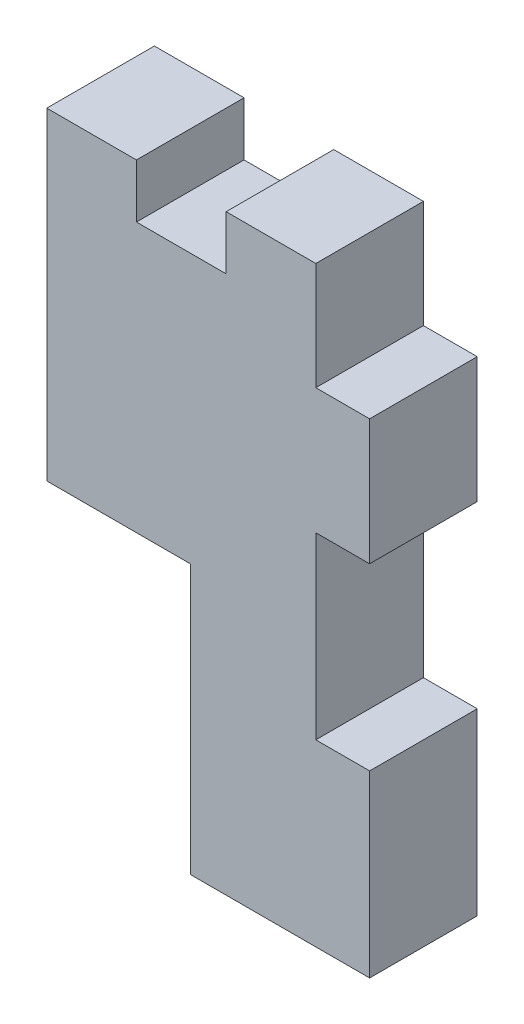
ISO-10303-21;
HEADER;
FILE_DESCRIPTION(('STEP AP214'),'2;1');
FILE_NAME('part.step','',(''),(''),'','','');
FILE_SCHEMA(('AUTOMOTIVE_DESIGN { 1 0 10303 214 1 1 1 1 }'));
ENDSEC;
DATA;
#1=APPLICATION_CONTEXT('core data for automotive mechanical design processes');
#2=APPLICATION_PROTOCOL_DEFINITION('international standard','automotive_design',2000,#1);
#3=PRODUCT_CONTEXT('',#1,'mechanical');
#4=PRODUCT('Part','Part','',(#3));
#5=PRODUCT_RELATED_PRODUCT_CATEGORY('part','',(#4));
#6=PRODUCT_DEFINITION_FORMATION('','',#4);
#7=PRODUCT_DEFINITION_CONTEXT('part definition',#1,'design');
#8=PRODUCT_DEFINITION('design','',#6,#7);
#9=PRODUCT_DEFINITION_SHAPE('','',#8);
#10=(LENGTH_UNIT() NAMED_UNIT(*) SI_UNIT(.MILLI.,.METRE.));
#11=(NAMED_UNIT(*) PLANE_ANGLE_UNIT() SI_UNIT($,.RADIAN.));
#12=(NAMED_UNIT(*) SI_UNIT($,.STERADIAN.) SOLID_ANGLE_UNIT());
#13=UNCERTAINTY_MEASURE_WITH_UNIT(LENGTH_MEASURE(1.E-05),#10,'distance_accuracy_value','');
#14=(GEOMETRIC_REPRESENTATION_CONTEXT(3) GLOBAL_UNCERTAINTY_ASSIGNED_CONTEXT((#13)) GLOBAL_UNIT_ASSIGNED_CONTEXT((#10,
#11,#12)) REPRESENTATION_CONTEXT('',''));
#15=CARTESIAN_POINT('',(0.,0.,0.));
#16=DIRECTION('',(0.,0.,1.));
#17=DIRECTION('',(1.,0.,0.));
#18=AXIS2_PLACEMENT_3D('',#15,#16,#17);
#19=CARTESIAN_POINT('',(-15.,0.,3.));
#20=DIRECTION('',(-1.,0.,0.));
#21=DIRECTION('',(0.,0.,1.));
#22=AXIS2_PLACEMENT_3D('',#19,#20,#21);
#23=PLANE('',#22);
#24=DIRECTION('',(0.,1.,0.));
#25=VECTOR('',#24,1.);
#26=CARTESIAN_POINT('',(-15.,0.,-3.));
#27=LINE('',#26,#25);
#28=CARTESIAN_POINT('',(-15.,15.,-3.));
#29=VERTEX_POINT('',#28);
#30=CARTESIAN_POINT('',(-15.,33.,-3.));
#31=VERTEX_POINT('',#30);
#32=EDGE_CURVE('E178',#29,#31,#27,.T.);
#33=ORIENTED_EDGE('',*,*,#32,.F.);
#34=DIRECTION('',(0.,0.,-1.));
#35=VECTOR('',#34,1.);
#36=CARTESIAN_POINT('',(-15.,15.,3.));
#37=LINE('',#36,#35);
#38=CARTESIAN_POINT('',(-15.,15.,3.));
#39=VERTEX_POINT('',#38);
#40=EDGE_CURVE('E11',#39,#29,#37,.T.);
#41=ORIENTED_EDGE('',*,*,#40,.F.);
#42=DIRECTION('',(0.,1.,0.));
#43=VECTOR('',#42,1.);
#44=CARTESIAN_POINT('',(-15.,0.,3.));
#45=LINE('',#44,#43);
#46=CARTESIAN_POINT('',(-15.,33.,3.));
#47=VERTEX_POINT('',#46);
#48=EDGE_CURVE('E213',#39,#47,#45,.T.);
#49=ORIENTED_EDGE('',*,*,#48,.T.);
#50=DIRECTION('',(0.,0.,-1.));
#51=VECTOR('',#50,1.);
#52=CARTESIAN_POINT('',(-15.,33.,3.));
#53=LINE('',#52,#51);
#54=EDGE_CURVE('E60',#47,#31,#53,.T.);
#55=ORIENTED_EDGE('',*,*,#54,.T.);
#56=EDGE_LOOP('',(#33,#41,#49,#55));
#57=FACE_BOUND('',#56,.T.);
#58=ADVANCED_FACE('F37',(#57),#23,.T.);
#59=CARTESIAN_POINT('',(0.,15.,3.));
#60=DIRECTION('',(0.,1.,0.));
#61=DIRECTION('',(0.,0.,1.));
#62=AXIS2_PLACEMENT_3D('',#59,#60,#61);
#63=PLANE('',#62);
#64=DIRECTION('',(1.,0.,0.));
#65=VECTOR('',#64,1.);
#66=CARTESIAN_POINT('',(0.,15.,-3.));
#67=LINE('',#66,#65);
#68=CARTESIAN_POINT('',(-7.,15.,-3.));
#69=VERTEX_POINT('',#68);
#70=EDGE_CURVE('E180',#29,#69,#67,.T.);
#71=ORIENTED_EDGE('',*,*,#70,.T.);
#72=DIRECTION('',(0.,0.,-1.));
#73=VECTOR('',#72,1.);
#74=CARTESIAN_POINT('',(-7.,15.,3.));
#75=LINE('',#74,#73);
#76=CARTESIAN_POINT('',(-7.,15.,3.));
#77=VERTEX_POINT('',#76);
#78=EDGE_CURVE('E44',#77,#69,#75,.T.);
#79=ORIENTED_EDGE('',*,*,#78,.F.);
#80=DIRECTION('',(1.,0.,0.));
#81=VECTOR('',#80,1.);
#82=CARTESIAN_POINT('',(0.,15.,3.));
#83=LINE('',#82,#81);
#84=EDGE_CURVE('E284',#39,#77,#83,.T.);
#85=ORIENTED_EDGE('',*,*,#84,.F.);
#86=ORIENTED_EDGE('',*,*,#40,.T.);
#87=EDGE_LOOP('',(#71,#79,#85,#86));
#88=FACE_BOUND('',#87,.T.);
#89=ADVANCED_FACE('F327',(#88),#63,.F.);
#90=CARTESIAN_POINT('',(-7.,0.,3.));
#91=DIRECTION('',(1.,0.,0.));
#92=DIRECTION('',(0.,1.,0.));
#93=AXIS2_PLACEMENT_3D('',#90,#91,#92);
#94=PLANE('',#93);
#95=DIRECTION('',(0.,-1.,0.));
#96=VECTOR('',#95,1.);
#97=CARTESIAN_POINT('',(-7.,0.,-3.));
#98=LINE('',#97,#96);
#99=CARTESIAN_POINT('',(-7.,0.,-3.));
#100=VERTEX_POINT('',#99);
#101=EDGE_CURVE('E183',#69,#100,#98,.T.);
#102=ORIENTED_EDGE('',*,*,#101,.T.);
#103=DIRECTION('',(0.,0.,-1.));
#104=VECTOR('',#103,1.);
#105=CARTESIAN_POINT('',(-7.,0.,3.));
#106=LINE('',#105,#104);
#107=CARTESIAN_POINT('',(-7.,0.,3.));
#108=VERTEX_POINT('',#107);
#109=EDGE_CURVE('E235',#108,#100,#106,.T.);
#110=ORIENTED_EDGE('',*,*,#109,.F.);
#111=DIRECTION('',(0.,-1.,0.));
#112=VECTOR('',#111,1.);
#113=CARTESIAN_POINT('',(-7.,0.,3.));
#114=LINE('',#113,#112);
#115=EDGE_CURVE('E244',#77,#108,#114,.T.);
#116=ORIENTED_EDGE('',*,*,#115,.F.);
#117=ORIENTED_EDGE('',*,*,#78,.T.);
#118=EDGE_LOOP('',(#102,#110,#116,#117));
#119=FACE_BOUND('',#118,.T.);
#120=ADVANCED_FACE('F242',(#119),#94,.F.);
#121=CARTESIAN_POINT('',(0.,0.,3.));
#122=DIRECTION('',(0.,1.,0.));
#123=DIRECTION('',(0.,0.,1.));
#124=AXIS2_PLACEMENT_3D('',#121,#122,#123);
#125=PLANE('',#124);
#126=DIRECTION('',(1.,0.,0.));
#127=VECTOR('',#126,1.);
#128=CARTESIAN_POINT('',(0.,0.,-3.));
#129=LINE('',#128,#127);
#130=CARTESIAN_POINT('',(3.,0.,-3.));
#131=VERTEX_POINT('',#130);
#132=EDGE_CURVE('E185',#100,#131,#129,.T.);
#133=ORIENTED_EDGE('',*,*,#132,.T.);
#134=DIRECTION('',(0.,0.,-1.));
#135=VECTOR('',#134,1.);
#136=CARTESIAN_POINT('',(3.,0.,3.));
#137=LINE('',#136,#135);
#138=CARTESIAN_POINT('',(3.,0.,3.));
#139=VERTEX_POINT('',#138);
#140=EDGE_CURVE('E232',#139,#131,#137,.T.);
#141=ORIENTED_EDGE('',*,*,#140,.F.);
#142=DIRECTION('',(1.,0.,0.));
#143=VECTOR('',#142,1.);
#144=CARTESIAN_POINT('',(0.,0.,3.));
#145=LINE('',#144,#143);
#146=EDGE_CURVE('E262',#108,#139,#145,.T.);
#147=ORIENTED_EDGE('',*,*,#146,.F.);
#148=ORIENTED_EDGE('',*,*,#109,.T.);
#149=EDGE_LOOP('',(#133,#141,#147,#148));
#150=FACE_BOUND('',#149,.T.);
#151=ADVANCED_FACE('F252',(#150),#125,.F.);
#152=CARTESIAN_POINT('',(3.,0.,3.));
#153=DIRECTION('',(-1.,0.,0.));
#154=DIRECTION('',(0.,0.,1.));
#155=AXIS2_PLACEMENT_3D('',#152,#153,#154);
#156=PLANE('',#155);
#157=DIRECTION('',(0.,1.,0.));
#158=VECTOR('',#157,1.);
#159=CARTESIAN_POINT('',(3.,0.,-3.));
#160=LINE('',#159,#158);
#161=CARTESIAN_POINT('',(3.,10.,-3.));
#162=VERTEX_POINT('',#161);
#163=EDGE_CURVE('E187',#131,#162,#160,.T.);
#164=ORIENTED_EDGE('',*,*,#163,.T.);
#165=DIRECTION('',(0.,0.,-1.));
#166=VECTOR('',#165,1.);
#167=CARTESIAN_POINT('',(3.,10.,3.));
#168=LINE('',#167,#166);
#169=CARTESIAN_POINT('',(3.,10.,3.));
#170=VERTEX_POINT('',#169);
#171=EDGE_CURVE('E230',#170,#162,#168,.T.);
#172=ORIENTED_EDGE('',*,*,#171,.F.);
#173=DIRECTION('',(0.,1.,0.));
#174=VECTOR('',#173,1.);
#175=CARTESIAN_POINT('',(3.,0.,3.));
#176=LINE('',#175,#174);
#177=EDGE_CURVE('E258',#139,#170,#176,.T.);
#178=ORIENTED_EDGE('',*,*,#177,.F.);
#179=ORIENTED_EDGE('',*,*,#140,.T.);
#180=EDGE_LOOP('',(#164,#172,#178,#179));
#181=FACE_BOUND('',#180,.T.);
#182=ADVANCED_FACE('F256',(#181),#156,.F.);
#183=CARTESIAN_POINT('',(0.,10.,3.));
#184=DIRECTION('',(0.,1.,0.));
#185=DIRECTION('',(0.,0.,1.));
#186=AXIS2_PLACEMENT_3D('',#183,#184,#185);
#187=PLANE('',#186);
#188=DIRECTION('',(1.,0.,0.));
#189=VECTOR('',#188,1.);
#190=CARTESIAN_POINT('',(0.,10.,-3.));
#191=LINE('',#190,#189);
#192=CARTESIAN_POINT('',(0.,10.,-3.));
#193=VERTEX_POINT('',#192);
#194=EDGE_CURVE('E190',#193,#162,#191,.T.);
#195=ORIENTED_EDGE('',*,*,#194,.F.);
#196=DIRECTION('',(0.,0.,-1.));
#197=VECTOR('',#196,1.);
#198=CARTESIAN_POINT('',(0.,10.,3.));
#199=LINE('',#198,#197);
#200=CARTESIAN_POINT('',(0.,10.,3.));
#201=VERTEX_POINT('',#200);
#202=EDGE_CURVE('E228',#201,#193,#199,.T.);
#203=ORIENTED_EDGE('',*,*,#202,.F.);
#204=DIRECTION('',(1.,0.,0.));
#205=VECTOR('',#204,1.);
#206=CARTESIAN_POINT('',(0.,10.,3.));
#207=LINE('',#206,#205);
#208=EDGE_CURVE('E261',#201,#170,#207,.T.);
#209=ORIENTED_EDGE('',*,*,#208,.T.);
#210=ORIENTED_EDGE('',*,*,#171,.T.);
#211=EDGE_LOOP('',(#195,#203,#209,#210));
#212=FACE_BOUND('',#211,.T.);
#213=ADVANCED_FACE('F315',(#212),#187,.T.);
#214=CARTESIAN_POINT('',(0.,0.,3.));
#215=DIRECTION('',(-1.,0.,0.));
#216=DIRECTION('',(0.,0.,1.));
#217=AXIS2_PLACEMENT_3D('',#214,#215,#216);
#218=PLANE('',#217);
#219=DIRECTION('',(0.,1.,0.));
#220=VECTOR('',#219,1.);
#221=CARTESIAN_POINT('',(0.,0.,-3.));
#222=LINE('',#221,#220);
#223=CARTESIAN_POINT('',(0.,20.,-3.));
#224=VERTEX_POINT('',#223);
#225=EDGE_CURVE('E193',#193,#224,#222,.T.);
#226=ORIENTED_EDGE('',*,*,#225,.T.);
#227=DIRECTION('',(0.,0.,-1.));
#228=VECTOR('',#227,1.);
#229=CARTESIAN_POINT('',(0.,20.,3.));
#230=LINE('',#229,#228);
#231=CARTESIAN_POINT('',(0.,20.,3.));
#232=VERTEX_POINT('',#231);
#233=EDGE_CURVE('E225',#232,#224,#230,.T.);
#234=ORIENTED_EDGE('',*,*,#233,.F.);
#235=DIRECTION('',(0.,1.,0.));
#236=VECTOR('',#235,1.);
#237=CARTESIAN_POINT('',(0.,0.,3.));
#238=LINE('',#237,#236);
#239=EDGE_CURVE('E264',#201,#232,#238,.T.);
#240=ORIENTED_EDGE('',*,*,#239,.F.);
#241=ORIENTED_EDGE('',*,*,#202,.T.);
#242=EDGE_LOOP('',(#226,#234,#240,#241));
#243=FACE_BOUND('',#242,.T.);
#244=ADVANCED_FACE('F317',(#243),#218,.F.);
#245=CARTESIAN_POINT('',(0.,20.,3.));
#246=DIRECTION('',(0.,1.,0.));
#247=DIRECTION('',(0.,0.,1.));
#248=AXIS2_PLACEMENT_3D('',#245,#246,#247);
#249=PLANE('',#248);
#250=DIRECTION('',(1.,0.,0.));
#251=VECTOR('',#250,1.);
#252=CARTESIAN_POINT('',(0.,20.,-3.));
#253=LINE('',#252,#251);
#254=CARTESIAN_POINT('',(3.,20.,-3.));
#255=VERTEX_POINT('',#254);
#256=EDGE_CURVE('E195',#224,#255,#253,.T.);
#257=ORIENTED_EDGE('',*,*,#256,.T.);
#258=DIRECTION('',(0.,0.,-1.));
#259=VECTOR('',#258,1.);
#260=CARTESIAN_POINT('',(3.,20.,3.));
#261=LINE('',#260,#259);
#262=CARTESIAN_POINT('',(3.,20.,3.));
#263=VERTEX_POINT('',#262);
#264=EDGE_CURVE('E222',#263,#255,#261,.T.);
#265=ORIENTED_EDGE('',*,*,#264,.F.);
#266=DIRECTION('',(1.,0.,0.));
#267=VECTOR('',#266,1.);
#268=CARTESIAN_POINT('',(0.,20.,3.));
#269=LINE('',#268,#267);
#270=EDGE_CURVE('E270',#232,#263,#269,.T.);
#271=ORIENTED_EDGE('',*,*,#270,.F.);
#272=ORIENTED_EDGE('',*,*,#233,.T.);
#273=EDGE_LOOP('',(#257,#265,#271,#272));
#274=FACE_BOUND('',#273,.T.);
#275=ADVANCED_FACE('F309',(#274),#249,.F.);
#276=CARTESIAN_POINT('',(3.00000000000001,0.,3.));
#277=DIRECTION('',(1.,0.,0.));
#278=DIRECTION('',(0.,1.,0.));
#279=AXIS2_PLACEMENT_3D('',#276,#277,#278);
#280=PLANE('',#279);
#281=DIRECTION('',(0.,0.,1.));
#282=VECTOR('',#281,1.);
#283=CARTESIAN_POINT('',(3.,27.,-3.));
#284=LINE('',#283,#282);
#285=CARTESIAN_POINT('',(3.,27.,-3.));
#286=VERTEX_POINT('',#285);
#287=CARTESIAN_POINT('',(3.,27.,3.));
#288=VERTEX_POINT('',#287);
#289=EDGE_CURVE('E181',#286,#288,#284,.T.);
#290=ORIENTED_EDGE('',*,*,#289,.T.);
#291=DIRECTION('',(0.,-1.,0.));
#292=VECTOR('',#291,1.);
#293=CARTESIAN_POINT('',(3.00000000000001,0.,3.));
#294=LINE('',#293,#292);
#295=EDGE_CURVE('E273',#288,#263,#294,.T.);
#296=ORIENTED_EDGE('',*,*,#295,.T.);
#297=ORIENTED_EDGE('',*,*,#264,.T.);
#298=DIRECTION('',(0.,-1.,0.));
#299=VECTOR('',#298,1.);
#300=CARTESIAN_POINT('',(3.00000000000001,0.,-3.));
#301=LINE('',#300,#299);
#302=EDGE_CURVE('E198',#286,#255,#301,.T.);
#303=ORIENTED_EDGE('',*,*,#302,.F.);
#304=EDGE_LOOP('',(#290,#296,#297,#303));
#305=FACE_BOUND('',#304,.T.);
#306=ADVANCED_FACE('F304',(#305),#280,.T.);
#307=CARTESIAN_POINT('',(0.,0.,3.));
#308=DIRECTION('',(-1.,0.,0.));
#309=DIRECTION('',(0.,0.,1.));
#310=AXIS2_PLACEMENT_3D('',#307,#308,#309);
#311=PLANE('',#310);
#312=DIRECTION('',(0.,1.,0.));
#313=VECTOR('',#312,1.);
#314=CARTESIAN_POINT('',(0.,0.,-3.));
#315=LINE('',#314,#313);
#316=CARTESIAN_POINT('',(0.,27.,-3.));
#317=VERTEX_POINT('',#316);
#318=CARTESIAN_POINT('',(0.,33.,-3.));
#319=VERTEX_POINT('',#318);
#320=EDGE_CURVE('E51',#317,#319,#315,.T.);
#321=ORIENTED_EDGE('',*,*,#320,.T.);
#322=DIRECTION('',(0.,0.,-1.));
#323=VECTOR('',#322,1.);
#324=CARTESIAN_POINT('',(0.,33.,3.));
#325=LINE('',#324,#323);
#326=CARTESIAN_POINT('',(0.,33.,3.));
#327=VERTEX_POINT('',#326);
#328=EDGE_CURVE('E219',#327,#319,#325,.T.);
#329=ORIENTED_EDGE('',*,*,#328,.F.);
#330=DIRECTION('',(0.,1.,0.));
#331=VECTOR('',#330,1.);
#332=CARTESIAN_POINT('',(0.,0.,3.));
#333=LINE('',#332,#331);
#334=CARTESIAN_POINT('',(0.,27.,3.));
#335=VERTEX_POINT('',#334);
#336=EDGE_CURVE('E275',#335,#327,#333,.T.);
#337=ORIENTED_EDGE('',*,*,#336,.F.);
#338=DIRECTION('',(0.,0.,1.));
#339=VECTOR('',#338,1.);
#340=CARTESIAN_POINT('',(0.,27.,-3.));
#341=LINE('',#340,#339);
#342=EDGE_CURVE('E288',#317,#335,#341,.T.);
#343=ORIENTED_EDGE('',*,*,#342,.F.);
#344=EDGE_LOOP('',(#321,#329,#337,#343));
#345=FACE_BOUND('',#344,.T.);
#346=ADVANCED_FACE('F371',(#345),#311,.F.);
#347=CARTESIAN_POINT('',(0.,33.,3.));
#348=DIRECTION('',(0.,-1.,0.));
#349=DIRECTION('',(0.,0.,-1.));
#350=AXIS2_PLACEMENT_3D('',#347,#348,#349);
#351=PLANE('',#350);
#352=DIRECTION('',(-1.,0.,0.));
#353=VECTOR('',#352,1.);
#354=CARTESIAN_POINT('',(0.,33.,-3.));
#355=LINE('',#354,#353);
#356=CARTESIAN_POINT('',(-5.,33.,-3.));
#357=VERTEX_POINT('',#356);
#358=EDGE_CURVE('E201',#319,#357,#355,.T.);
#359=ORIENTED_EDGE('',*,*,#358,.T.);
#360=DIRECTION('',(0.,0.,-1.));
#361=VECTOR('',#360,1.);
#362=CARTESIAN_POINT('',(-5.,33.,3.));
#363=LINE('',#362,#361);
#364=CARTESIAN_POINT('',(-5.,33.,3.));
#365=VERTEX_POINT('',#364);
#366=EDGE_CURVE('E217',#365,#357,#363,.T.);
#367=ORIENTED_EDGE('',*,*,#366,.F.);
#368=DIRECTION('',(-1.,0.,0.));
#369=VECTOR('',#368,1.);
#370=CARTESIAN_POINT('',(0.,33.,3.));
#371=LINE('',#370,#369);
#372=EDGE_CURVE('E277',#327,#365,#371,.T.);
#373=ORIENTED_EDGE('',*,*,#372,.F.);
#374=ORIENTED_EDGE('',*,*,#328,.T.);
#375=EDGE_LOOP('',(#359,#367,#373,#374));
#376=FACE_BOUND('',#375,.T.);
#377=ADVANCED_FACE('F366',(#376),#351,.F.);
#378=CARTESIAN_POINT('',(-5.,0.,3.));
#379=DIRECTION('',(-1.,0.,0.));
#380=DIRECTION('',(0.,0.,1.));
#381=AXIS2_PLACEMENT_3D('',#378,#379,#380);
#382=PLANE('',#381);
#383=DIRECTION('',(0.,1.,0.));
#384=VECTOR('',#383,1.);
#385=CARTESIAN_POINT('',(-5.,0.,-3.));
#386=LINE('',#385,#384);
#387=CARTESIAN_POINT('',(-5.,30.,-3.));
#388=VERTEX_POINT('',#387);
#389=EDGE_CURVE('E204',#388,#357,#386,.T.);
#390=ORIENTED_EDGE('',*,*,#389,.F.);
#391=DIRECTION('',(0.,0.,-1.));
#392=VECTOR('',#391,1.);
#393=CARTESIAN_POINT('',(-5.,30.,3.));
#394=LINE('',#393,#392);
#395=CARTESIAN_POINT('',(-5.,30.,3.));
#396=VERTEX_POINT('',#395);
#397=EDGE_CURVE('E169',#396,#388,#394,.T.);
#398=ORIENTED_EDGE('',*,*,#397,.F.);
#399=DIRECTION('',(0.,1.,0.));
#400=VECTOR('',#399,1.);
#401=CARTESIAN_POINT('',(-5.,0.,3.));
#402=LINE('',#401,#400);
#403=EDGE_CURVE('E158',#396,#365,#402,.T.);
#404=ORIENTED_EDGE('',*,*,#403,.T.);
#405=ORIENTED_EDGE('',*,*,#366,.T.);
#406=EDGE_LOOP('',(#390,#398,#404,#405));
#407=FACE_BOUND('',#406,.T.);
#408=ADVANCED_FACE('F280',(#407),#382,.T.);
#409=CARTESIAN_POINT('',(0.,30.,3.));
#410=DIRECTION('',(0.,-1.,0.));
#411=DIRECTION('',(1.,0.,0.));
#412=AXIS2_PLACEMENT_3D('',#409,#410,#411);
#413=PLANE('',#412);
#414=DIRECTION('',(-1.,0.,0.));
#415=VECTOR('',#414,1.);
#416=CARTESIAN_POINT('',(0.,30.,-3.));
#417=LINE('',#416,#415);
#418=CARTESIAN_POINT('',(-10.,30.,-3.));
#419=VERTEX_POINT('',#418);
#420=EDGE_CURVE('E165',#388,#419,#417,.T.);
#421=ORIENTED_EDGE('',*,*,#420,.T.);
#422=DIRECTION('',(0.,0.,-1.));
#423=VECTOR('',#422,1.);
#424=CARTESIAN_POINT('',(-10.,30.,3.));
#425=LINE('',#424,#423);
#426=CARTESIAN_POINT('',(-10.,30.,3.));
#427=VERTEX_POINT('',#426);
#428=EDGE_CURVE('E162',#427,#419,#425,.T.);
#429=ORIENTED_EDGE('',*,*,#428,.F.);
#430=DIRECTION('',(-1.,0.,0.));
#431=VECTOR('',#430,1.);
#432=CARTESIAN_POINT('',(0.,30.,3.));
#433=LINE('',#432,#431);
#434=EDGE_CURVE('E149',#396,#427,#433,.T.);
#435=ORIENTED_EDGE('',*,*,#434,.F.);
#436=ORIENTED_EDGE('',*,*,#397,.T.);
#437=EDGE_LOOP('',(#421,#429,#435,#436));
#438=FACE_BOUND('',#437,.T.);
#439=ADVANCED_FACE('F163',(#438),#413,.F.);
#440=CARTESIAN_POINT('',(-10.,0.,3.));
#441=DIRECTION('',(-1.,0.,0.));
#442=DIRECTION('',(0.,0.,1.));
#443=AXIS2_PLACEMENT_3D('',#440,#441,#442);
#444=PLANE('',#443);
#445=DIRECTION('',(0.,1.,0.));
#446=VECTOR('',#445,1.);
#447=CARTESIAN_POINT('',(-10.,0.,-3.));
#448=LINE('',#447,#446);
#449=CARTESIAN_POINT('',(-10.,33.,-3.));
#450=VERTEX_POINT('',#449);
#451=EDGE_CURVE('E208',#419,#450,#448,.T.);
#452=ORIENTED_EDGE('',*,*,#451,.T.);
#453=DIRECTION('',(0.,0.,-1.));
#454=VECTOR('',#453,1.);
#455=CARTESIAN_POINT('',(-10.,33.,3.));
#456=LINE('',#455,#454);
#457=CARTESIAN_POINT('',(-10.,33.,3.));
#458=VERTEX_POINT('',#457);
#459=EDGE_CURVE('E170',#458,#450,#456,.T.);
#460=ORIENTED_EDGE('',*,*,#459,.F.);
#461=DIRECTION('',(0.,1.,0.));
#462=VECTOR('',#461,1.);
#463=CARTESIAN_POINT('',(-10.,0.,3.));
#464=LINE('',#463,#462);
#465=EDGE_CURVE('E155',#427,#458,#464,.T.);
#466=ORIENTED_EDGE('',*,*,#465,.F.);
#467=ORIENTED_EDGE('',*,*,#428,.T.);
#468=EDGE_LOOP('',(#452,#460,#466,#467));
#469=FACE_BOUND('',#468,.T.);
#470=ADVANCED_FACE('F172',(#469),#444,.F.);
#471=CARTESIAN_POINT('',(0.,33.,3.));
#472=DIRECTION('',(0.,1.,0.));
#473=DIRECTION('',(0.,0.,1.));
#474=AXIS2_PLACEMENT_3D('',#471,#472,#473);
#475=PLANE('',#474);
#476=DIRECTION('',(1.,0.,0.));
#477=VECTOR('',#476,1.);
#478=CARTESIAN_POINT('',(0.,33.,-3.));
#479=LINE('',#478,#477);
#480=EDGE_CURVE('E210',#31,#450,#479,.T.);
#481=ORIENTED_EDGE('',*,*,#480,.F.);
#482=ORIENTED_EDGE('',*,*,#54,.F.);
#483=DIRECTION('',(1.,0.,0.));
#484=VECTOR('',#483,1.);
#485=CARTESIAN_POINT('',(0.,33.,3.));
#486=LINE('',#485,#484);
#487=EDGE_CURVE('E173',#47,#458,#486,.T.);
#488=ORIENTED_EDGE('',*,*,#487,.T.);
#489=ORIENTED_EDGE('',*,*,#459,.T.);
#490=EDGE_LOOP('',(#481,#482,#488,#489));
#491=FACE_BOUND('',#490,.T.);
#492=ADVANCED_FACE('F282',(#491),#475,.T.);
#493=CARTESIAN_POINT('',(0.,0.,3.));
#494=DIRECTION('',(0.,0.,1.));
#495=DIRECTION('',(1.,0.,0.));
#496=AXIS2_PLACEMENT_3D('',#493,#494,#495);
#497=PLANE('',#496);
#498=DIRECTION('',(1.,0.,0.));
#499=VECTOR('',#498,1.);
#500=CARTESIAN_POINT('',(3.,27.,3.));
#501=LINE('',#500,#499);
#502=EDGE_CURVE('E294',#335,#288,#501,.T.);
#503=ORIENTED_EDGE('',*,*,#502,.F.);
#504=ORIENTED_EDGE('',*,*,#336,.T.);
#505=ORIENTED_EDGE('',*,*,#372,.T.);
#506=ORIENTED_EDGE('',*,*,#403,.F.);
#507=ORIENTED_EDGE('',*,*,#434,.T.);
#508=ORIENTED_EDGE('',*,*,#465,.T.);
#509=ORIENTED_EDGE('',*,*,#487,.F.);
#510=ORIENTED_EDGE('',*,*,#48,.F.);
#511=ORIENTED_EDGE('',*,*,#84,.T.);
#512=ORIENTED_EDGE('',*,*,#115,.T.);
#513=ORIENTED_EDGE('',*,*,#146,.T.);
#514=ORIENTED_EDGE('',*,*,#177,.T.);
#515=ORIENTED_EDGE('',*,*,#208,.F.);
#516=ORIENTED_EDGE('',*,*,#239,.T.);
#517=ORIENTED_EDGE('',*,*,#270,.T.);
#518=ORIENTED_EDGE('',*,*,#295,.F.);
#519=EDGE_LOOP('',(#503,#504,#505,#506,#507,#508,#509,#510,#511,#512,#513,#514,#515,#516,#517,#518));
#520=FACE_BOUND('',#519,.T.);
#521=ADVANCED_FACE('F152',(#520),#497,.T.);
#522=CARTESIAN_POINT('',(0.,0.,-3.));
#523=DIRECTION('',(0.,0.,1.));
#524=DIRECTION('',(1.,0.,0.));
#525=AXIS2_PLACEMENT_3D('',#522,#523,#524);
#526=PLANE('',#525);
#527=ORIENTED_EDGE('',*,*,#320,.F.);
#528=DIRECTION('',(1.,0.,0.));
#529=VECTOR('',#528,1.);
#530=CARTESIAN_POINT('',(3.,27.,-3.));
#531=LINE('',#530,#529);
#532=EDGE_CURVE('E291',#317,#286,#531,.T.);
#533=ORIENTED_EDGE('',*,*,#532,.T.);
#534=ORIENTED_EDGE('',*,*,#302,.T.);
#535=ORIENTED_EDGE('',*,*,#256,.F.);
#536=ORIENTED_EDGE('',*,*,#225,.F.);
#537=ORIENTED_EDGE('',*,*,#194,.T.);
#538=ORIENTED_EDGE('',*,*,#163,.F.);
#539=ORIENTED_EDGE('',*,*,#132,.F.);
#540=ORIENTED_EDGE('',*,*,#101,.F.);
#541=ORIENTED_EDGE('',*,*,#70,.F.);
#542=ORIENTED_EDGE('',*,*,#32,.T.);
#543=ORIENTED_EDGE('',*,*,#480,.T.);
#544=ORIENTED_EDGE('',*,*,#451,.F.);
#545=ORIENTED_EDGE('',*,*,#420,.F.);
#546=ORIENTED_EDGE('',*,*,#389,.T.);
#547=ORIENTED_EDGE('',*,*,#358,.F.);
#548=EDGE_LOOP('',(#527,#533,#534,#535,#536,#537,#538,#539,#540,#541,#542,#543,#544,#545,#546,#547));
#549=FACE_BOUND('',#548,.T.);
#550=ADVANCED_FACE('F248',(#549),#526,.F.);
#551=CARTESIAN_POINT('',(3.,27.,-3.));
#552=DIRECTION('',(0.,-1.,0.));
#553=DIRECTION('',(0.,0.,-1.));
#554=AXIS2_PLACEMENT_3D('',#551,#552,#553);
#555=PLANE('',#554);
#556=ORIENTED_EDGE('',*,*,#502,.T.);
#557=ORIENTED_EDGE('',*,*,#289,.F.);
#558=ORIENTED_EDGE('',*,*,#532,.F.);
#559=ORIENTED_EDGE('',*,*,#342,.T.);
#560=EDGE_LOOP('',(#556,#557,#558,#559));
#561=FACE_BOUND('',#560,.T.);
#562=ADVANCED_FACE('F438',(#561),#555,.F.);
#563=CLOSED_SHELL('',(#58,#89,#120,#151,#182,#213,#244,#275,#306,#346,#377,#408,#439,#470,#492,
#521,#550,#562));
#564=MANIFOLD_SOLID_BREP('B2',#563);
#565=ADVANCED_BREP_SHAPE_REPRESENTATION('',(#18,#564),#14);
#566=SHAPE_DEFINITION_REPRESENTATION(#9,#565);
ENDSEC;
END-ISO-10303-21;
